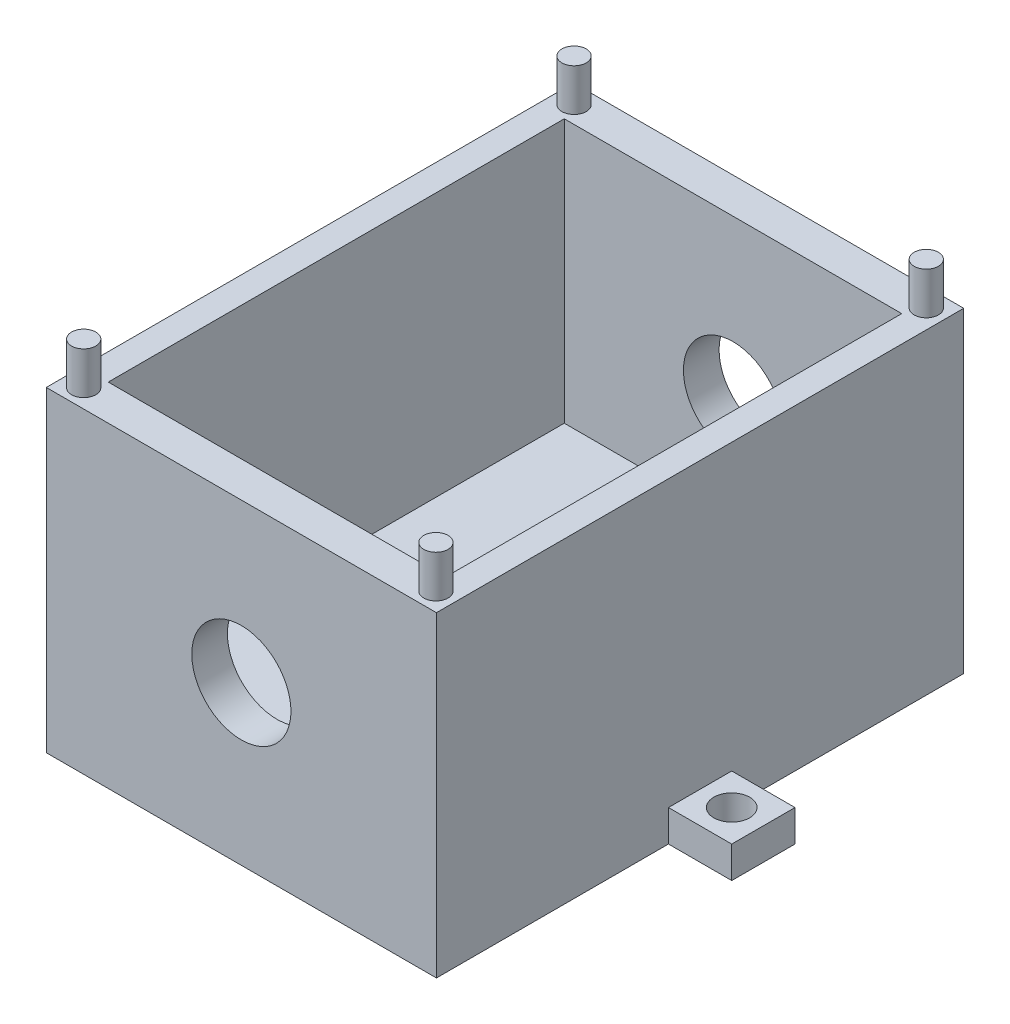
ISO-10303-21;
HEADER;
FILE_DESCRIPTION(('STEP AP214'),'2;1');
FILE_NAME('part.step','',(''),(''),'','','');
FILE_SCHEMA(('AUTOMOTIVE_DESIGN { 1 0 10303 214 1 1 1 1 }'));
ENDSEC;
DATA;
#1=APPLICATION_CONTEXT('core data for automotive mechanical design processes');
#2=APPLICATION_PROTOCOL_DEFINITION('international standard','automotive_design',2000,#1);
#3=PRODUCT_CONTEXT('',#1,'mechanical');
#4=PRODUCT('Part','Part','',(#3));
#5=PRODUCT_RELATED_PRODUCT_CATEGORY('part','',(#4));
#6=PRODUCT_DEFINITION_FORMATION('','',#4);
#7=PRODUCT_DEFINITION_CONTEXT('part definition',#1,'design');
#8=PRODUCT_DEFINITION('design','',#6,#7);
#9=PRODUCT_DEFINITION_SHAPE('','',#8);
#10=(LENGTH_UNIT() NAMED_UNIT(*) SI_UNIT(.MILLI.,.METRE.));
#11=(NAMED_UNIT(*) PLANE_ANGLE_UNIT() SI_UNIT($,.RADIAN.));
#12=(NAMED_UNIT(*) SI_UNIT($,.STERADIAN.) SOLID_ANGLE_UNIT());
#13=UNCERTAINTY_MEASURE_WITH_UNIT(LENGTH_MEASURE(1.E-05),#10,'distance_accuracy_value','');
#14=(GEOMETRIC_REPRESENTATION_CONTEXT(3) GLOBAL_UNCERTAINTY_ASSIGNED_CONTEXT((#13)) GLOBAL_UNIT_ASSIGNED_CONTEXT((#10,
#11,#12)) REPRESENTATION_CONTEXT('',''));
#15=CARTESIAN_POINT('',(0.,0.,0.));
#16=DIRECTION('',(0.,0.,1.));
#17=DIRECTION('',(1.,0.,0.));
#18=AXIS2_PLACEMENT_3D('',#15,#16,#17);
#19=CARTESIAN_POINT('',(18.5,25.,25.));
#20=DIRECTION('',(-1.,0.,0.));
#21=DIRECTION('',(0.,0.,1.));
#22=AXIS2_PLACEMENT_3D('',#19,#20,#21);
#23=PLANE('',#22);
#24=DIRECTION('',(0.,-1.,0.));
#25=VECTOR('',#24,1.);
#26=CARTESIAN_POINT('',(18.5,-2.,3.));
#27=LINE('',#26,#25);
#28=CARTESIAN_POINT('',(18.5,-2.,3.));
#29=VERTEX_POINT('',#28);
#30=CARTESIAN_POINT('',(18.5,-5.,3.));
#31=VERTEX_POINT('',#30);
#32=EDGE_CURVE('E178',#29,#31,#27,.T.);
#33=ORIENTED_EDGE('',*,*,#32,.F.);
#34=DIRECTION('',(0.,0.,1.));
#35=VECTOR('',#34,1.);
#36=CARTESIAN_POINT('',(18.5,-2.,0.));
#37=LINE('',#36,#35);
#38=CARTESIAN_POINT('',(18.5,-2.,-3.));
#39=VERTEX_POINT('',#38);
#40=EDGE_CURVE('E162',#39,#29,#37,.T.);
#41=ORIENTED_EDGE('',*,*,#40,.F.);
#42=DIRECTION('',(0.,-1.,0.));
#43=VECTOR('',#42,1.);
#44=CARTESIAN_POINT('',(18.5,-2.,-3.));
#45=LINE('',#44,#43);
#46=CARTESIAN_POINT('',(18.5,-5.,-3.00000000000001));
#47=VERTEX_POINT('',#46);
#48=EDGE_CURVE('E168',#39,#47,#45,.T.);
#49=ORIENTED_EDGE('',*,*,#48,.T.);
#50=DIRECTION('',(0.,0.,1.));
#51=VECTOR('',#50,1.);
#52=CARTESIAN_POINT('',(18.5,-5.,-25.));
#53=LINE('',#52,#51);
#54=CARTESIAN_POINT('',(18.5,-5.,-25.));
#55=VERTEX_POINT('',#54);
#56=EDGE_CURVE('E271',#55,#47,#53,.T.);
#57=ORIENTED_EDGE('',*,*,#56,.F.);
#58=DIRECTION('',(0.,-1.,0.));
#59=VECTOR('',#58,1.);
#60=CARTESIAN_POINT('',(18.5,25.,-25.));
#61=LINE('',#60,#59);
#62=CARTESIAN_POINT('',(18.5,25.,-25.));
#63=VERTEX_POINT('',#62);
#64=EDGE_CURVE('E318',#63,#55,#61,.T.);
#65=ORIENTED_EDGE('',*,*,#64,.F.);
#66=DIRECTION('',(0.,0.,-1.));
#67=VECTOR('',#66,1.);
#68=CARTESIAN_POINT('',(18.5,25.,25.));
#69=LINE('',#68,#67);
#70=CARTESIAN_POINT('',(18.5,25.,25.));
#71=VERTEX_POINT('',#70);
#72=EDGE_CURVE('E311',#71,#63,#69,.T.);
#73=ORIENTED_EDGE('',*,*,#72,.F.);
#74=DIRECTION('',(0.,-1.,0.));
#75=VECTOR('',#74,1.);
#76=CARTESIAN_POINT('',(18.5,25.,25.));
#77=LINE('',#76,#75);
#78=CARTESIAN_POINT('',(18.5,-5.,25.));
#79=VERTEX_POINT('',#78);
#80=EDGE_CURVE('E53',#71,#79,#77,.T.);
#81=ORIENTED_EDGE('',*,*,#80,.T.);
#82=EDGE_CURVE('E270',#31,#79,#53,.T.);
#83=ORIENTED_EDGE('',*,*,#82,.F.);
#84=EDGE_LOOP('',(#33,#41,#49,#57,#65,#73,#81,#83));
#85=FACE_BOUND('',#84,.T.);
#86=ADVANCED_FACE('F44',(#85),#23,.F.);
#87=CARTESIAN_POINT('',(-18.5,25.,25.));
#88=DIRECTION('',(1.,0.,0.));
#89=DIRECTION('',(0.,0.,-1.));
#90=AXIS2_PLACEMENT_3D('',#87,#88,#89);
#91=PLANE('',#90);
#92=DIRECTION('',(0.,-1.,0.));
#93=VECTOR('',#92,1.);
#94=CARTESIAN_POINT('',(-18.5,-2.,-3.));
#95=LINE('',#94,#93);
#96=CARTESIAN_POINT('',(-18.5,-2.,-3.));
#97=VERTEX_POINT('',#96);
#98=CARTESIAN_POINT('',(-18.5,-5.,-3.));
#99=VERTEX_POINT('',#98);
#100=EDGE_CURVE('E223',#97,#99,#95,.T.);
#101=ORIENTED_EDGE('',*,*,#100,.F.);
#102=DIRECTION('',(0.,0.,1.));
#103=VECTOR('',#102,1.);
#104=CARTESIAN_POINT('',(-18.5,-2.,0.));
#105=LINE('',#104,#103);
#106=CARTESIAN_POINT('',(-18.5,-2.,3.));
#107=VERTEX_POINT('',#106);
#108=EDGE_CURVE('E203',#97,#107,#105,.T.);
#109=ORIENTED_EDGE('',*,*,#108,.T.);
#110=DIRECTION('',(0.,-1.,0.));
#111=VECTOR('',#110,1.);
#112=CARTESIAN_POINT('',(-18.5,-2.,3.));
#113=LINE('',#112,#111);
#114=CARTESIAN_POINT('',(-18.5,-5.,2.99999999999999));
#115=VERTEX_POINT('',#114);
#116=EDGE_CURVE('E216',#107,#115,#113,.T.);
#117=ORIENTED_EDGE('',*,*,#116,.T.);
#118=DIRECTION('',(0.,0.,-1.));
#119=VECTOR('',#118,1.);
#120=CARTESIAN_POINT('',(-18.5,-5.,-25.));
#121=LINE('',#120,#119);
#122=CARTESIAN_POINT('',(-18.5,-5.,25.));
#123=VERTEX_POINT('',#122);
#124=EDGE_CURVE('E264',#123,#115,#121,.T.);
#125=ORIENTED_EDGE('',*,*,#124,.F.);
#126=DIRECTION('',(0.,-1.,0.));
#127=VECTOR('',#126,1.);
#128=CARTESIAN_POINT('',(-18.5,25.,25.));
#129=LINE('',#128,#127);
#130=CARTESIAN_POINT('',(-18.5,25.,25.));
#131=VERTEX_POINT('',#130);
#132=EDGE_CURVE('E11',#131,#123,#129,.T.);
#133=ORIENTED_EDGE('',*,*,#132,.F.);
#134=DIRECTION('',(0.,0.,1.));
#135=VECTOR('',#134,1.);
#136=CARTESIAN_POINT('',(-18.5,25.,25.));
#137=LINE('',#136,#135);
#138=CARTESIAN_POINT('',(-18.5,25.,-25.));
#139=VERTEX_POINT('',#138);
#140=EDGE_CURVE('E306',#139,#131,#137,.T.);
#141=ORIENTED_EDGE('',*,*,#140,.F.);
#142=DIRECTION('',(0.,-1.,0.));
#143=VECTOR('',#142,1.);
#144=CARTESIAN_POINT('',(-18.5,25.,-25.));
#145=LINE('',#144,#143);
#146=CARTESIAN_POINT('',(-18.5,-5.,-25.));
#147=VERTEX_POINT('',#146);
#148=EDGE_CURVE('E315',#139,#147,#145,.T.);
#149=ORIENTED_EDGE('',*,*,#148,.T.);
#150=EDGE_CURVE('E263',#99,#147,#121,.T.);
#151=ORIENTED_EDGE('',*,*,#150,.F.);
#152=EDGE_LOOP('',(#101,#109,#117,#125,#133,#141,#149,#151));
#153=FACE_BOUND('',#152,.T.);
#154=ADVANCED_FACE('F46',(#153),#91,.F.);
#155=CARTESIAN_POINT('',(0.,25.,0.));
#156=DIRECTION('',(0.,1.,0.));
#157=DIRECTION('',(0.,0.,1.));
#158=AXIS2_PLACEMENT_3D('',#155,#156,#157);
#159=PLANE('',#158);
#160=CARTESIAN_POINT('',(-16.7,25.,23.25));
#161=DIRECTION('',(0.,1.,0.));
#162=DIRECTION('',(0.,0.,-1.));
#163=AXIS2_PLACEMENT_3D('',#160,#161,#162);
#164=CIRCLE('',#163,1.15);
#165=CARTESIAN_POINT('',(-16.7,25.,22.1));
#166=VERTEX_POINT('',#165);
#167=EDGE_CURVE('E244',#166,#166,#164,.T.);
#168=ORIENTED_EDGE('',*,*,#167,.F.);
#169=EDGE_LOOP('',(#168));
#170=FACE_BOUND('',#169,.T.);
#171=CARTESIAN_POINT('',(16.7,25.,23.25));
#172=DIRECTION('',(0.,1.,0.));
#173=DIRECTION('',(0.,0.,1.));
#174=AXIS2_PLACEMENT_3D('',#171,#172,#173);
#175=CIRCLE('',#174,1.15);
#176=CARTESIAN_POINT('',(16.7,25.,24.4));
#177=VERTEX_POINT('',#176);
#178=EDGE_CURVE('E238',#177,#177,#175,.T.);
#179=ORIENTED_EDGE('',*,*,#178,.F.);
#180=EDGE_LOOP('',(#179));
#181=FACE_BOUND('',#180,.T.);
#182=CARTESIAN_POINT('',(16.7,25.,-23.25));
#183=DIRECTION('',(0.,1.,0.));
#184=DIRECTION('',(0.,0.,-1.));
#185=AXIS2_PLACEMENT_3D('',#182,#183,#184);
#186=CIRCLE('',#185,1.15);
#187=CARTESIAN_POINT('',(16.7,25.,-24.4));
#188=VERTEX_POINT('',#187);
#189=EDGE_CURVE('E231',#188,#188,#186,.T.);
#190=ORIENTED_EDGE('',*,*,#189,.F.);
#191=EDGE_LOOP('',(#190));
#192=FACE_BOUND('',#191,.T.);
#193=CARTESIAN_POINT('',(-16.7,25.,-23.25));
#194=DIRECTION('',(0.,1.,0.));
#195=DIRECTION('',(0.,0.,1.));
#196=AXIS2_PLACEMENT_3D('',#193,#194,#195);
#197=CIRCLE('',#196,1.15);
#198=CARTESIAN_POINT('',(-16.7,25.,-22.1));
#199=VERTEX_POINT('',#198);
#200=EDGE_CURVE('E234',#199,#199,#197,.T.);
#201=ORIENTED_EDGE('',*,*,#200,.F.);
#202=EDGE_LOOP('',(#201));
#203=FACE_BOUND('',#202,.T.);
#204=ORIENTED_EDGE('',*,*,#140,.T.);
#205=DIRECTION('',(1.,0.,0.));
#206=VECTOR('',#205,1.);
#207=CARTESIAN_POINT('',(18.5,25.,25.));
#208=LINE('',#207,#206);
#209=EDGE_CURVE('E309',#131,#71,#208,.T.);
#210=ORIENTED_EDGE('',*,*,#209,.T.);
#211=ORIENTED_EDGE('',*,*,#72,.T.);
#212=DIRECTION('',(-1.,0.,0.));
#213=VECTOR('',#212,1.);
#214=CARTESIAN_POINT('',(18.5,25.,-25.));
#215=LINE('',#214,#213);
#216=EDGE_CURVE('E313',#63,#139,#215,.T.);
#217=ORIENTED_EDGE('',*,*,#216,.T.);
#218=EDGE_LOOP('',(#204,#210,#211,#217));
#219=FACE_BOUND('',#218,.T.);
#220=DIRECTION('',(1.,0.,0.));
#221=VECTOR('',#220,1.);
#222=CARTESIAN_POINT('',(16.,25.,21.6216216216216));
#223=LINE('',#222,#221);
#224=CARTESIAN_POINT('',(-16.,25.,21.6216216216216));
#225=VERTEX_POINT('',#224);
#226=CARTESIAN_POINT('',(16.,25.,21.6216216216216));
#227=VERTEX_POINT('',#226);
#228=EDGE_CURVE('E279',#225,#227,#223,.T.);
#229=ORIENTED_EDGE('',*,*,#228,.F.);
#230=DIRECTION('',(0.,0.,1.));
#231=VECTOR('',#230,1.);
#232=CARTESIAN_POINT('',(-16.,25.,21.6216216216216));
#233=LINE('',#232,#231);
#234=CARTESIAN_POINT('',(-16.,25.,-21.6216216216216));
#235=VERTEX_POINT('',#234);
#236=EDGE_CURVE('E277',#235,#225,#233,.T.);
#237=ORIENTED_EDGE('',*,*,#236,.F.);
#238=DIRECTION('',(-1.,0.,0.));
#239=VECTOR('',#238,1.);
#240=CARTESIAN_POINT('',(16.,25.,-21.6216216216216));
#241=LINE('',#240,#239);
#242=CARTESIAN_POINT('',(16.,25.,-21.6216216216216));
#243=VERTEX_POINT('',#242);
#244=EDGE_CURVE('E285',#243,#235,#241,.T.);
#245=ORIENTED_EDGE('',*,*,#244,.F.);
#246=DIRECTION('',(0.,0.,-1.));
#247=VECTOR('',#246,1.);
#248=CARTESIAN_POINT('',(16.,25.,21.6216216216216));
#249=LINE('',#248,#247);
#250=EDGE_CURVE('E282',#227,#243,#249,.T.);
#251=ORIENTED_EDGE('',*,*,#250,.F.);
#252=EDGE_LOOP('',(#229,#237,#245,#251));
#253=FACE_BOUND('',#252,.T.);
#254=ADVANCED_FACE('F355',(#170,#181,#192,#203,#219,#253),#159,.T.);
#255=CARTESIAN_POINT('',(18.5,25.,25.));
#256=DIRECTION('',(0.,0.,-1.));
#257=DIRECTION('',(-1.,0.,0.));
#258=AXIS2_PLACEMENT_3D('',#255,#256,#257);
#259=PLANE('',#258);
#260=CARTESIAN_POINT('',(0.,10.,25.));
#261=DIRECTION('',(0.,0.,-1.));
#262=DIRECTION('',(-1.,0.,0.));
#263=AXIS2_PLACEMENT_3D('',#260,#261,#262);
#264=CIRCLE('',#263,4.7);
#265=CARTESIAN_POINT('',(-4.7,10.,25.));
#266=VERTEX_POINT('',#265);
#267=EDGE_CURVE('E260',#266,#266,#264,.T.);
#268=ORIENTED_EDGE('',*,*,#267,.T.);
#269=EDGE_LOOP('',(#268));
#270=FACE_BOUND('',#269,.T.);
#271=ORIENTED_EDGE('',*,*,#132,.T.);
#272=DIRECTION('',(-1.,0.,0.));
#273=VECTOR('',#272,1.);
#274=CARTESIAN_POINT('',(18.5,-5.,25.));
#275=LINE('',#274,#273);
#276=EDGE_CURVE('E273',#79,#123,#275,.T.);
#277=ORIENTED_EDGE('',*,*,#276,.F.);
#278=ORIENTED_EDGE('',*,*,#80,.F.);
#279=ORIENTED_EDGE('',*,*,#209,.F.);
#280=EDGE_LOOP('',(#271,#277,#278,#279));
#281=FACE_BOUND('',#280,.T.);
#282=ADVANCED_FACE('F326',(#270,#281),#259,.F.);
#283=CARTESIAN_POINT('',(18.5,25.,-25.));
#284=DIRECTION('',(0.,0.,1.));
#285=DIRECTION('',(1.,0.,0.));
#286=AXIS2_PLACEMENT_3D('',#283,#284,#285);
#287=PLANE('',#286);
#288=CARTESIAN_POINT('',(0.,10.,-25.));
#289=DIRECTION('',(0.,0.,-1.));
#290=DIRECTION('',(-1.,0.,0.));
#291=AXIS2_PLACEMENT_3D('',#288,#289,#290);
#292=CIRCLE('',#291,4.7);
#293=CARTESIAN_POINT('',(-4.70000000000001,10.,-25.));
#294=VERTEX_POINT('',#293);
#295=EDGE_CURVE('E252',#294,#294,#292,.T.);
#296=ORIENTED_EDGE('',*,*,#295,.F.);
#297=EDGE_LOOP('',(#296));
#298=FACE_BOUND('',#297,.T.);
#299=ORIENTED_EDGE('',*,*,#64,.T.);
#300=DIRECTION('',(1.,0.,0.));
#301=VECTOR('',#300,1.);
#302=CARTESIAN_POINT('',(18.5,-5.,-25.));
#303=LINE('',#302,#301);
#304=EDGE_CURVE('E267',#147,#55,#303,.T.);
#305=ORIENTED_EDGE('',*,*,#304,.F.);
#306=ORIENTED_EDGE('',*,*,#148,.F.);
#307=ORIENTED_EDGE('',*,*,#216,.F.);
#308=EDGE_LOOP('',(#299,#305,#306,#307));
#309=FACE_BOUND('',#308,.T.);
#310=ADVANCED_FACE('F353',(#298,#309),#287,.F.);
#311=CARTESIAN_POINT('',(-16.,25.,21.6216216216216));
#312=DIRECTION('',(1.,0.,0.));
#313=DIRECTION('',(0.,0.,-1.));
#314=AXIS2_PLACEMENT_3D('',#311,#312,#313);
#315=PLANE('',#314);
#316=DIRECTION('',(0.,0.,1.));
#317=VECTOR('',#316,1.);
#318=CARTESIAN_POINT('',(-16.,0.,21.6216216216216));
#319=LINE('',#318,#317);
#320=CARTESIAN_POINT('',(-16.,0.,-21.6216216216216));
#321=VERTEX_POINT('',#320);
#322=CARTESIAN_POINT('',(-16.,0.,21.6216216216216));
#323=VERTEX_POINT('',#322);
#324=EDGE_CURVE('E276',#321,#323,#319,.T.);
#325=ORIENTED_EDGE('',*,*,#324,.F.);
#326=DIRECTION('',(0.,-1.,0.));
#327=VECTOR('',#326,1.);
#328=CARTESIAN_POINT('',(-16.,25.,-21.6216216216216));
#329=LINE('',#328,#327);
#330=EDGE_CURVE('E287',#235,#321,#329,.T.);
#331=ORIENTED_EDGE('',*,*,#330,.F.);
#332=ORIENTED_EDGE('',*,*,#236,.T.);
#333=DIRECTION('',(0.,-1.,0.));
#334=VECTOR('',#333,1.);
#335=CARTESIAN_POINT('',(-16.,25.,21.6216216216216));
#336=LINE('',#335,#334);
#337=EDGE_CURVE('E303',#225,#323,#336,.T.);
#338=ORIENTED_EDGE('',*,*,#337,.T.);
#339=EDGE_LOOP('',(#325,#331,#332,#338));
#340=FACE_BOUND('',#339,.T.);
#341=ADVANCED_FACE('F376',(#340),#315,.T.);
#342=CARTESIAN_POINT('',(16.,25.,21.6216216216216));
#343=DIRECTION('',(0.,0.,-1.));
#344=DIRECTION('',(-1.,0.,0.));
#345=AXIS2_PLACEMENT_3D('',#342,#343,#344);
#346=PLANE('',#345);
#347=CARTESIAN_POINT('',(0.,10.,21.6216216216216));
#348=DIRECTION('',(0.,0.,-1.));
#349=DIRECTION('',(-1.,0.,0.));
#350=AXIS2_PLACEMENT_3D('',#347,#348,#349);
#351=CIRCLE('',#350,4.7);
#352=CARTESIAN_POINT('',(-4.7,10.,21.6216216216216));
#353=VERTEX_POINT('',#352);
#354=EDGE_CURVE('E257',#353,#353,#351,.T.);
#355=ORIENTED_EDGE('',*,*,#354,.F.);
#356=EDGE_LOOP('',(#355));
#357=FACE_BOUND('',#356,.T.);
#358=DIRECTION('',(1.,0.,0.));
#359=VECTOR('',#358,1.);
#360=CARTESIAN_POINT('',(16.,0.,21.6216216216216));
#361=LINE('',#360,#359);
#362=CARTESIAN_POINT('',(16.,0.,21.6216216216216));
#363=VERTEX_POINT('',#362);
#364=EDGE_CURVE('E290',#323,#363,#361,.T.);
#365=ORIENTED_EDGE('',*,*,#364,.F.);
#366=ORIENTED_EDGE('',*,*,#337,.F.);
#367=ORIENTED_EDGE('',*,*,#228,.T.);
#368=DIRECTION('',(0.,-1.,0.));
#369=VECTOR('',#368,1.);
#370=CARTESIAN_POINT('',(16.,25.,21.6216216216216));
#371=LINE('',#370,#369);
#372=EDGE_CURVE('E301',#227,#363,#371,.T.);
#373=ORIENTED_EDGE('',*,*,#372,.T.);
#374=EDGE_LOOP('',(#365,#366,#367,#373));
#375=FACE_BOUND('',#374,.T.);
#376=ADVANCED_FACE('F367',(#357,#375),#346,.T.);
#377=CARTESIAN_POINT('',(16.,25.,21.6216216216216));
#378=DIRECTION('',(-1.,0.,0.));
#379=DIRECTION('',(0.,0.,1.));
#380=AXIS2_PLACEMENT_3D('',#377,#378,#379);
#381=PLANE('',#380);
#382=DIRECTION('',(0.,0.,-1.));
#383=VECTOR('',#382,1.);
#384=CARTESIAN_POINT('',(16.,0.,21.6216216216216));
#385=LINE('',#384,#383);
#386=CARTESIAN_POINT('',(16.,0.,-21.6216216216216));
#387=VERTEX_POINT('',#386);
#388=EDGE_CURVE('E293',#363,#387,#385,.T.);
#389=ORIENTED_EDGE('',*,*,#388,.F.);
#390=ORIENTED_EDGE('',*,*,#372,.F.);
#391=ORIENTED_EDGE('',*,*,#250,.T.);
#392=DIRECTION('',(0.,-1.,0.));
#393=VECTOR('',#392,1.);
#394=CARTESIAN_POINT('',(16.,25.,-21.6216216216216));
#395=LINE('',#394,#393);
#396=EDGE_CURVE('E299',#243,#387,#395,.T.);
#397=ORIENTED_EDGE('',*,*,#396,.T.);
#398=EDGE_LOOP('',(#389,#390,#391,#397));
#399=FACE_BOUND('',#398,.T.);
#400=ADVANCED_FACE('F370',(#399),#381,.T.);
#401=CARTESIAN_POINT('',(16.,25.,-21.6216216216216));
#402=DIRECTION('',(0.,0.,1.));
#403=DIRECTION('',(1.,0.,0.));
#404=AXIS2_PLACEMENT_3D('',#401,#402,#403);
#405=PLANE('',#404);
#406=CARTESIAN_POINT('',(0.,10.,-21.6216216216216));
#407=DIRECTION('',(0.,0.,1.));
#408=DIRECTION('',(1.,0.,0.));
#409=AXIS2_PLACEMENT_3D('',#406,#407,#408);
#410=CIRCLE('',#409,4.7);
#411=CARTESIAN_POINT('',(4.7,10.,-21.6216216216216));
#412=VERTEX_POINT('',#411);
#413=EDGE_CURVE('E48',#412,#412,#410,.T.);
#414=ORIENTED_EDGE('',*,*,#413,.F.);
#415=EDGE_LOOP('',(#414));
#416=FACE_BOUND('',#415,.T.);
#417=DIRECTION('',(-1.,0.,0.));
#418=VECTOR('',#417,1.);
#419=CARTESIAN_POINT('',(16.,0.,-21.6216216216216));
#420=LINE('',#419,#418);
#421=EDGE_CURVE('E280',#387,#321,#420,.T.);
#422=ORIENTED_EDGE('',*,*,#421,.F.);
#423=ORIENTED_EDGE('',*,*,#396,.F.);
#424=ORIENTED_EDGE('',*,*,#244,.T.);
#425=ORIENTED_EDGE('',*,*,#330,.T.);
#426=EDGE_LOOP('',(#422,#423,#424,#425));
#427=FACE_BOUND('',#426,.T.);
#428=ADVANCED_FACE('F379',(#416,#427),#405,.T.);
#429=CARTESIAN_POINT('',(0.,0.,0.));
#430=DIRECTION('',(0.,-1.,0.));
#431=DIRECTION('',(0.,0.,-1.));
#432=AXIS2_PLACEMENT_3D('',#429,#430,#431);
#433=PLANE('',#432);
#434=ORIENTED_EDGE('',*,*,#421,.T.);
#435=ORIENTED_EDGE('',*,*,#324,.T.);
#436=ORIENTED_EDGE('',*,*,#364,.T.);
#437=ORIENTED_EDGE('',*,*,#388,.T.);
#438=EDGE_LOOP('',(#434,#435,#436,#437));
#439=FACE_BOUND('',#438,.T.);
#440=ADVANCED_FACE('F373',(#439),#433,.F.);
#441=CARTESIAN_POINT('',(0.,-5.,0.));
#442=DIRECTION('',(0.,-1.,0.));
#443=DIRECTION('',(0.,0.,-1.));
#444=AXIS2_PLACEMENT_3D('',#441,#442,#443);
#445=PLANE('',#444);
#446=ORIENTED_EDGE('',*,*,#124,.T.);
#447=DIRECTION('',(-1.,0.,0.));
#448=VECTOR('',#447,1.);
#449=CARTESIAN_POINT('',(-24.5,-5.,3.));
#450=LINE('',#449,#448);
#451=CARTESIAN_POINT('',(-24.5,-5.,3.));
#452=VERTEX_POINT('',#451);
#453=EDGE_CURVE('E68',#115,#452,#450,.T.);
#454=ORIENTED_EDGE('',*,*,#453,.T.);
#455=DIRECTION('',(0.,0.,-1.));
#456=VECTOR('',#455,1.);
#457=CARTESIAN_POINT('',(-24.5,-5.,-3.));
#458=LINE('',#457,#456);
#459=CARTESIAN_POINT('',(-24.5,-5.,-3.));
#460=VERTEX_POINT('',#459);
#461=EDGE_CURVE('E218',#452,#460,#458,.T.);
#462=ORIENTED_EDGE('',*,*,#461,.T.);
#463=DIRECTION('',(1.,0.,0.));
#464=VECTOR('',#463,1.);
#465=CARTESIAN_POINT('',(-18.5,-5.,-3.));
#466=LINE('',#465,#464);
#467=EDGE_CURVE('E207',#460,#99,#466,.T.);
#468=ORIENTED_EDGE('',*,*,#467,.T.);
#469=ORIENTED_EDGE('',*,*,#150,.T.);
#470=ORIENTED_EDGE('',*,*,#304,.T.);
#471=ORIENTED_EDGE('',*,*,#56,.T.);
#472=DIRECTION('',(-1.,0.,0.));
#473=VECTOR('',#472,1.);
#474=CARTESIAN_POINT('',(18.5,-5.,-3.));
#475=LINE('',#474,#473);
#476=CARTESIAN_POINT('',(24.5,-5.,-3.));
#477=VERTEX_POINT('',#476);
#478=EDGE_CURVE('E60',#477,#47,#475,.T.);
#479=ORIENTED_EDGE('',*,*,#478,.F.);
#480=DIRECTION('',(0.,0.,-1.));
#481=VECTOR('',#480,1.);
#482=CARTESIAN_POINT('',(24.5,-5.,-3.));
#483=LINE('',#482,#481);
#484=CARTESIAN_POINT('',(24.5,-5.,3.));
#485=VERTEX_POINT('',#484);
#486=EDGE_CURVE('E181',#485,#477,#483,.T.);
#487=ORIENTED_EDGE('',*,*,#486,.F.);
#488=DIRECTION('',(1.,0.,0.));
#489=VECTOR('',#488,1.);
#490=CARTESIAN_POINT('',(24.5,-5.,3.));
#491=LINE('',#490,#489);
#492=EDGE_CURVE('E179',#31,#485,#491,.T.);
#493=ORIENTED_EDGE('',*,*,#492,.F.);
#494=ORIENTED_EDGE('',*,*,#82,.T.);
#495=ORIENTED_EDGE('',*,*,#276,.T.);
#496=EDGE_LOOP('',(#446,#454,#462,#468,#469,#470,#471,#479,#487,#493,#494,#495));
#497=FACE_BOUND('',#496,.T.);
#498=CARTESIAN_POINT('',(-21.5,-5.,0.));
#499=DIRECTION('',(0.,-1.,0.));
#500=DIRECTION('',(0.,0.,-1.));
#501=AXIS2_PLACEMENT_3D('',#498,#499,#500);
#502=CIRCLE('',#501,1.7);
#503=CARTESIAN_POINT('',(-21.5,-5.,-1.7));
#504=VERTEX_POINT('',#503);
#505=EDGE_CURVE('E193',#504,#504,#502,.T.);
#506=ORIENTED_EDGE('',*,*,#505,.F.);
#507=EDGE_LOOP('',(#506));
#508=FACE_BOUND('',#507,.T.);
#509=CARTESIAN_POINT('',(21.5,-5.,0.));
#510=DIRECTION('',(0.,1.,0.));
#511=DIRECTION('',(0.,0.,-1.));
#512=AXIS2_PLACEMENT_3D('',#509,#510,#511);
#513=CIRCLE('',#512,1.7);
#514=CARTESIAN_POINT('',(21.5,-5.,-1.7));
#515=VERTEX_POINT('',#514);
#516=EDGE_CURVE('E184',#515,#515,#513,.T.);
#517=ORIENTED_EDGE('',*,*,#516,.T.);
#518=EDGE_LOOP('',(#517));
#519=FACE_BOUND('',#518,.T.);
#520=ADVANCED_FACE('F330',(#497,#508,#519),#445,.T.);
#521=CARTESIAN_POINT('',(0.,10.,40.));
#522=DIRECTION('',(0.,0.,-1.));
#523=DIRECTION('',(-1.,0.,0.));
#524=AXIS2_PLACEMENT_3D('',#521,#522,#523);
#525=CYLINDRICAL_SURFACE('',#524,4.7);
#526=ORIENTED_EDGE('',*,*,#413,.T.);
#527=EDGE_LOOP('',(#526));
#528=FACE_BOUND('',#527,.T.);
#529=ORIENTED_EDGE('',*,*,#295,.T.);
#530=EDGE_LOOP('',(#529));
#531=FACE_BOUND('',#530,.T.);
#532=ADVANCED_FACE('F411',(#528,#531),#525,.F.);
#533=ORIENTED_EDGE('',*,*,#354,.T.);
#534=EDGE_LOOP('',(#533));
#535=FACE_BOUND('',#534,.T.);
#536=ORIENTED_EDGE('',*,*,#267,.F.);
#537=EDGE_LOOP('',(#536));
#538=FACE_BOUND('',#537,.T.);
#539=ADVANCED_FACE('F408',(#535,#538),#525,.F.);
#540=CARTESIAN_POINT('',(-16.7,29.,-23.25));
#541=DIRECTION('',(0.,-1.,0.));
#542=DIRECTION('',(0.,0.,-1.));
#543=AXIS2_PLACEMENT_3D('',#540,#541,#542);
#544=CYLINDRICAL_SURFACE('',#543,1.15);
#545=CARTESIAN_POINT('',(-16.7,29.,-23.25));
#546=DIRECTION('',(0.,1.,0.));
#547=DIRECTION('',(0.,0.,1.));
#548=AXIS2_PLACEMENT_3D('',#545,#546,#547);
#549=CIRCLE('',#548,1.15);
#550=CARTESIAN_POINT('',(-16.7,29.,-22.1));
#551=VERTEX_POINT('',#550);
#552=EDGE_CURVE('E249',#551,#551,#549,.T.);
#553=ORIENTED_EDGE('',*,*,#552,.F.);
#554=EDGE_LOOP('',(#553));
#555=FACE_BOUND('',#554,.T.);
#556=ORIENTED_EDGE('',*,*,#200,.T.);
#557=EDGE_LOOP('',(#556));
#558=FACE_BOUND('',#557,.T.);
#559=ADVANCED_FACE('F410',(#555,#558),#544,.T.);
#560=CARTESIAN_POINT('',(-16.7,29.,-23.25));
#561=DIRECTION('',(0.,1.,0.));
#562=DIRECTION('',(0.,0.,1.));
#563=AXIS2_PLACEMENT_3D('',#560,#561,#562);
#564=PLANE('',#563);
#565=ORIENTED_EDGE('',*,*,#552,.T.);
#566=EDGE_LOOP('',(#565));
#567=FACE_BOUND('',#566,.T.);
#568=ADVANCED_FACE('F417',(#567),#564,.T.);
#569=CARTESIAN_POINT('',(16.7,29.,-23.25));
#570=DIRECTION('',(0.,-1.,0.));
#571=DIRECTION('',(0.,0.,-1.));
#572=AXIS2_PLACEMENT_3D('',#569,#570,#571);
#573=CYLINDRICAL_SURFACE('',#572,1.15);
#574=CARTESIAN_POINT('',(16.7,29.,-23.25));
#575=DIRECTION('',(0.,1.,0.));
#576=DIRECTION('',(0.,0.,-1.));
#577=AXIS2_PLACEMENT_3D('',#574,#575,#576);
#578=CIRCLE('',#577,1.15);
#579=CARTESIAN_POINT('',(16.7,29.,-24.4));
#580=VERTEX_POINT('',#579);
#581=EDGE_CURVE('E235',#580,#580,#578,.T.);
#582=ORIENTED_EDGE('',*,*,#581,.F.);
#583=EDGE_LOOP('',(#582));
#584=FACE_BOUND('',#583,.T.);
#585=ORIENTED_EDGE('',*,*,#189,.T.);
#586=EDGE_LOOP('',(#585));
#587=FACE_BOUND('',#586,.T.);
#588=ADVANCED_FACE('F565',(#584,#587),#573,.T.);
#589=CARTESIAN_POINT('',(16.7,29.,-23.25));
#590=DIRECTION('',(0.,-1.,0.));
#591=DIRECTION('',(0.,0.,-1.));
#592=AXIS2_PLACEMENT_3D('',#589,#590,#591);
#593=PLANE('',#592);
#594=ORIENTED_EDGE('',*,*,#581,.T.);
#595=EDGE_LOOP('',(#594));
#596=FACE_BOUND('',#595,.T.);
#597=ADVANCED_FACE('F556',(#596),#593,.F.);
#598=CARTESIAN_POINT('',(16.7,29.,23.25));
#599=DIRECTION('',(0.,-1.,0.));
#600=DIRECTION('',(0.,0.,-1.));
#601=AXIS2_PLACEMENT_3D('',#598,#599,#600);
#602=CYLINDRICAL_SURFACE('',#601,1.15);
#603=CARTESIAN_POINT('',(16.7,29.,23.25));
#604=DIRECTION('',(0.,1.,0.));
#605=DIRECTION('',(0.,0.,1.));
#606=AXIS2_PLACEMENT_3D('',#603,#604,#605);
#607=CIRCLE('',#606,1.15);
#608=CARTESIAN_POINT('',(16.7,29.,24.4));
#609=VERTEX_POINT('',#608);
#610=EDGE_CURVE('E241',#609,#609,#607,.T.);
#611=ORIENTED_EDGE('',*,*,#610,.F.);
#612=EDGE_LOOP('',(#611));
#613=FACE_BOUND('',#612,.T.);
#614=ORIENTED_EDGE('',*,*,#178,.T.);
#615=EDGE_LOOP('',(#614));
#616=FACE_BOUND('',#615,.T.);
#617=ADVANCED_FACE('F547',(#613,#616),#602,.T.);
#618=CARTESIAN_POINT('',(16.7,29.,23.25));
#619=DIRECTION('',(0.,1.,0.));
#620=DIRECTION('',(0.,0.,1.));
#621=AXIS2_PLACEMENT_3D('',#618,#619,#620);
#622=PLANE('',#621);
#623=ORIENTED_EDGE('',*,*,#610,.T.);
#624=EDGE_LOOP('',(#623));
#625=FACE_BOUND('',#624,.T.);
#626=ADVANCED_FACE('F538',(#625),#622,.T.);
#627=CARTESIAN_POINT('',(-16.7,29.,23.25));
#628=DIRECTION('',(0.,-1.,0.));
#629=DIRECTION('',(0.,0.,-1.));
#630=AXIS2_PLACEMENT_3D('',#627,#628,#629);
#631=CYLINDRICAL_SURFACE('',#630,1.15);
#632=CARTESIAN_POINT('',(-16.7,29.,23.25));
#633=DIRECTION('',(0.,1.,0.));
#634=DIRECTION('',(0.,0.,-1.));
#635=AXIS2_PLACEMENT_3D('',#632,#633,#634);
#636=CIRCLE('',#635,1.15);
#637=CARTESIAN_POINT('',(-16.7,29.,22.1));
#638=VERTEX_POINT('',#637);
#639=EDGE_CURVE('E225',#638,#638,#636,.T.);
#640=ORIENTED_EDGE('',*,*,#639,.F.);
#641=EDGE_LOOP('',(#640));
#642=FACE_BOUND('',#641,.T.);
#643=ORIENTED_EDGE('',*,*,#167,.T.);
#644=EDGE_LOOP('',(#643));
#645=FACE_BOUND('',#644,.T.);
#646=ADVANCED_FACE('F529',(#642,#645),#631,.T.);
#647=CARTESIAN_POINT('',(-16.7,29.,23.25));
#648=DIRECTION('',(0.,-1.,0.));
#649=DIRECTION('',(0.,0.,-1.));
#650=AXIS2_PLACEMENT_3D('',#647,#648,#649);
#651=PLANE('',#650);
#652=ORIENTED_EDGE('',*,*,#639,.T.);
#653=EDGE_LOOP('',(#652));
#654=FACE_BOUND('',#653,.T.);
#655=ADVANCED_FACE('F514',(#654),#651,.F.);
#656=CARTESIAN_POINT('',(-18.5,-2.,-3.));
#657=DIRECTION('',(0.,0.,-1.));
#658=DIRECTION('',(-1.,0.,0.));
#659=AXIS2_PLACEMENT_3D('',#656,#657,#658);
#660=PLANE('',#659);
#661=ORIENTED_EDGE('',*,*,#467,.F.);
#662=DIRECTION('',(0.,-1.,0.));
#663=VECTOR('',#662,1.);
#664=CARTESIAN_POINT('',(-24.5,-2.,-3.));
#665=LINE('',#664,#663);
#666=CARTESIAN_POINT('',(-24.5,-2.,-3.));
#667=VERTEX_POINT('',#666);
#668=EDGE_CURVE('E226',#667,#460,#665,.T.);
#669=ORIENTED_EDGE('',*,*,#668,.F.);
#670=DIRECTION('',(1.,0.,0.));
#671=VECTOR('',#670,1.);
#672=CARTESIAN_POINT('',(-18.5,-2.,-3.));
#673=LINE('',#672,#671);
#674=EDGE_CURVE('E213',#667,#97,#673,.T.);
#675=ORIENTED_EDGE('',*,*,#674,.T.);
#676=ORIENTED_EDGE('',*,*,#100,.T.);
#677=EDGE_LOOP('',(#661,#669,#675,#676));
#678=FACE_BOUND('',#677,.T.);
#679=ADVANCED_FACE('F348',(#678),#660,.T.);
#680=CARTESIAN_POINT('',(-24.5,-2.,-3.));
#681=DIRECTION('',(-1.,0.,0.));
#682=DIRECTION('',(0.,0.,1.));
#683=AXIS2_PLACEMENT_3D('',#680,#681,#682);
#684=PLANE('',#683);
#685=ORIENTED_EDGE('',*,*,#461,.F.);
#686=DIRECTION('',(0.,-1.,0.));
#687=VECTOR('',#686,1.);
#688=CARTESIAN_POINT('',(-24.5,-2.,3.));
#689=LINE('',#688,#687);
#690=CARTESIAN_POINT('',(-24.5,-2.,3.));
#691=VERTEX_POINT('',#690);
#692=EDGE_CURVE('E228',#691,#452,#689,.T.);
#693=ORIENTED_EDGE('',*,*,#692,.F.);
#694=DIRECTION('',(0.,0.,-1.));
#695=VECTOR('',#694,1.);
#696=CARTESIAN_POINT('',(-24.5,-2.,-3.));
#697=LINE('',#696,#695);
#698=EDGE_CURVE('E210',#691,#667,#697,.T.);
#699=ORIENTED_EDGE('',*,*,#698,.T.);
#700=ORIENTED_EDGE('',*,*,#668,.T.);
#701=EDGE_LOOP('',(#685,#693,#699,#700));
#702=FACE_BOUND('',#701,.T.);
#703=ADVANCED_FACE('F344',(#702),#684,.T.);
#704=CARTESIAN_POINT('',(-24.5,-2.,3.));
#705=DIRECTION('',(0.,0.,1.));
#706=DIRECTION('',(1.,0.,0.));
#707=AXIS2_PLACEMENT_3D('',#704,#705,#706);
#708=PLANE('',#707);
#709=ORIENTED_EDGE('',*,*,#453,.F.);
#710=ORIENTED_EDGE('',*,*,#116,.F.);
#711=DIRECTION('',(-1.,0.,0.));
#712=VECTOR('',#711,1.);
#713=CARTESIAN_POINT('',(-24.5,-2.,3.));
#714=LINE('',#713,#712);
#715=EDGE_CURVE('E206',#107,#691,#714,.T.);
#716=ORIENTED_EDGE('',*,*,#715,.T.);
#717=ORIENTED_EDGE('',*,*,#692,.T.);
#718=EDGE_LOOP('',(#709,#710,#716,#717));
#719=FACE_BOUND('',#718,.T.);
#720=ADVANCED_FACE('F337',(#719),#708,.T.);
#721=CARTESIAN_POINT('',(0.,-2.,0.));
#722=DIRECTION('',(0.,1.,0.));
#723=DIRECTION('',(0.,0.,1.));
#724=AXIS2_PLACEMENT_3D('',#721,#722,#723);
#725=PLANE('',#724);
#726=CARTESIAN_POINT('',(-21.5,-2.,0.));
#727=DIRECTION('',(0.,-1.,0.));
#728=DIRECTION('',(0.,0.,-1.));
#729=AXIS2_PLACEMENT_3D('',#726,#727,#728);
#730=CIRCLE('',#729,1.7);
#731=CARTESIAN_POINT('',(-21.5,-2.,-1.7));
#732=VERTEX_POINT('',#731);
#733=EDGE_CURVE('E198',#732,#732,#730,.T.);
#734=ORIENTED_EDGE('',*,*,#733,.T.);
#735=EDGE_LOOP('',(#734));
#736=FACE_BOUND('',#735,.T.);
#737=ORIENTED_EDGE('',*,*,#108,.F.);
#738=ORIENTED_EDGE('',*,*,#674,.F.);
#739=ORIENTED_EDGE('',*,*,#698,.F.);
#740=ORIENTED_EDGE('',*,*,#715,.F.);
#741=EDGE_LOOP('',(#737,#738,#739,#740));
#742=FACE_BOUND('',#741,.T.);
#743=ADVANCED_FACE('F340',(#736,#742),#725,.T.);
#744=CARTESIAN_POINT('',(-21.5,-2.,0.));
#745=DIRECTION('',(0.,-1.,0.));
#746=DIRECTION('',(0.,0.,-1.));
#747=AXIS2_PLACEMENT_3D('',#744,#745,#746);
#748=CYLINDRICAL_SURFACE('',#747,1.7);
#749=ORIENTED_EDGE('',*,*,#733,.F.);
#750=EDGE_LOOP('',(#749));
#751=FACE_BOUND('',#750,.T.);
#752=ORIENTED_EDGE('',*,*,#505,.T.);
#753=EDGE_LOOP('',(#752));
#754=FACE_BOUND('',#753,.T.);
#755=ADVANCED_FACE('F434',(#751,#754),#748,.F.);
#756=CARTESIAN_POINT('',(0.,-2.,0.));
#757=DIRECTION('',(0.,1.,0.));
#758=DIRECTION('',(0.,0.,1.));
#759=AXIS2_PLACEMENT_3D('',#756,#757,#758);
#760=PLANE('',#759);
#761=ORIENTED_EDGE('',*,*,#40,.T.);
#762=DIRECTION('',(1.,0.,0.));
#763=VECTOR('',#762,1.);
#764=CARTESIAN_POINT('',(24.5,-2.,3.));
#765=LINE('',#764,#763);
#766=CARTESIAN_POINT('',(24.5,-2.,3.));
#767=VERTEX_POINT('',#766);
#768=EDGE_CURVE('E174',#29,#767,#765,.T.);
#769=ORIENTED_EDGE('',*,*,#768,.T.);
#770=DIRECTION('',(0.,0.,-1.));
#771=VECTOR('',#770,1.);
#772=CARTESIAN_POINT('',(24.5,-2.,-3.));
#773=LINE('',#772,#771);
#774=CARTESIAN_POINT('',(24.5,-2.,-3.));
#775=VERTEX_POINT('',#774);
#776=EDGE_CURVE('E165',#767,#775,#773,.T.);
#777=ORIENTED_EDGE('',*,*,#776,.T.);
#778=DIRECTION('',(-1.,0.,0.));
#779=VECTOR('',#778,1.);
#780=CARTESIAN_POINT('',(18.5,-2.,-3.));
#781=LINE('',#780,#779);
#782=EDGE_CURVE('E158',#775,#39,#781,.T.);
#783=ORIENTED_EDGE('',*,*,#782,.T.);
#784=EDGE_LOOP('',(#761,#769,#777,#783));
#785=FACE_BOUND('',#784,.T.);
#786=CARTESIAN_POINT('',(21.5,-2.,0.));
#787=DIRECTION('',(0.,1.,0.));
#788=DIRECTION('',(0.,0.,-1.));
#789=AXIS2_PLACEMENT_3D('',#786,#787,#788);
#790=CIRCLE('',#789,1.7);
#791=CARTESIAN_POINT('',(21.5,-2.,-1.7));
#792=VERTEX_POINT('',#791);
#793=EDGE_CURVE('E190',#792,#792,#790,.T.);
#794=ORIENTED_EDGE('',*,*,#793,.F.);
#795=EDGE_LOOP('',(#794));
#796=FACE_BOUND('',#795,.T.);
#797=ADVANCED_FACE('F159',(#785,#796),#760,.T.);
#798=CARTESIAN_POINT('',(24.5,-2.,3.));
#799=DIRECTION('',(0.,0.,-1.));
#800=DIRECTION('',(-1.,0.,0.));
#801=AXIS2_PLACEMENT_3D('',#798,#799,#800);
#802=PLANE('',#801);
#803=ORIENTED_EDGE('',*,*,#492,.T.);
#804=DIRECTION('',(0.,-1.,0.));
#805=VECTOR('',#804,1.);
#806=CARTESIAN_POINT('',(24.5,-2.,3.));
#807=LINE('',#806,#805);
#808=EDGE_CURVE('E194',#767,#485,#807,.T.);
#809=ORIENTED_EDGE('',*,*,#808,.F.);
#810=ORIENTED_EDGE('',*,*,#768,.F.);
#811=ORIENTED_EDGE('',*,*,#32,.T.);
#812=EDGE_LOOP('',(#803,#809,#810,#811));
#813=FACE_BOUND('',#812,.T.);
#814=ADVANCED_FACE('F433',(#813),#802,.F.);
#815=CARTESIAN_POINT('',(24.5,-2.,-3.));
#816=DIRECTION('',(-1.,0.,0.));
#817=DIRECTION('',(0.,0.,1.));
#818=AXIS2_PLACEMENT_3D('',#815,#816,#817);
#819=PLANE('',#818);
#820=ORIENTED_EDGE('',*,*,#486,.T.);
#821=DIRECTION('',(0.,-1.,0.));
#822=VECTOR('',#821,1.);
#823=CARTESIAN_POINT('',(24.5,-2.,-3.));
#824=LINE('',#823,#822);
#825=EDGE_CURVE('E173',#775,#477,#824,.T.);
#826=ORIENTED_EDGE('',*,*,#825,.F.);
#827=ORIENTED_EDGE('',*,*,#776,.F.);
#828=ORIENTED_EDGE('',*,*,#808,.T.);
#829=EDGE_LOOP('',(#820,#826,#827,#828));
#830=FACE_BOUND('',#829,.T.);
#831=ADVANCED_FACE('F442',(#830),#819,.F.);
#832=CARTESIAN_POINT('',(18.5,-2.,-3.));
#833=DIRECTION('',(0.,0.,1.));
#834=DIRECTION('',(1.,0.,0.));
#835=AXIS2_PLACEMENT_3D('',#832,#833,#834);
#836=PLANE('',#835);
#837=ORIENTED_EDGE('',*,*,#478,.T.);
#838=ORIENTED_EDGE('',*,*,#48,.F.);
#839=ORIENTED_EDGE('',*,*,#782,.F.);
#840=ORIENTED_EDGE('',*,*,#825,.T.);
#841=EDGE_LOOP('',(#837,#838,#839,#840));
#842=FACE_BOUND('',#841,.T.);
#843=ADVANCED_FACE('F169',(#842),#836,.F.);
#844=CARTESIAN_POINT('',(21.5,-2.,0.));
#845=DIRECTION('',(0.,-1.,0.));
#846=DIRECTION('',(0.,0.,-1.));
#847=AXIS2_PLACEMENT_3D('',#844,#845,#846);
#848=CYLINDRICAL_SURFACE('',#847,1.7);
#849=ORIENTED_EDGE('',*,*,#793,.T.);
#850=EDGE_LOOP('',(#849));
#851=FACE_BOUND('',#850,.T.);
#852=ORIENTED_EDGE('',*,*,#516,.F.);
#853=EDGE_LOOP('',(#852));
#854=FACE_BOUND('',#853,.T.);
#855=ADVANCED_FACE('F459',(#851,#854),#848,.F.);
#856=CLOSED_SHELL('',(#86,#154,#254,#282,#310,#341,#376,#400,#428,#440,#520,#532,#539,#559,#568,
#588,#597,#617,#626,#646,#655,#679,#703,#720,#743,#755,#797,#814,#831,#843,#855));
#857=MANIFOLD_SOLID_BREP('B2',#856);
#858=ADVANCED_BREP_SHAPE_REPRESENTATION('',(#18,#857),#14);
#859=SHAPE_DEFINITION_REPRESENTATION(#9,#858);
ENDSEC;
END-ISO-10303-21;
